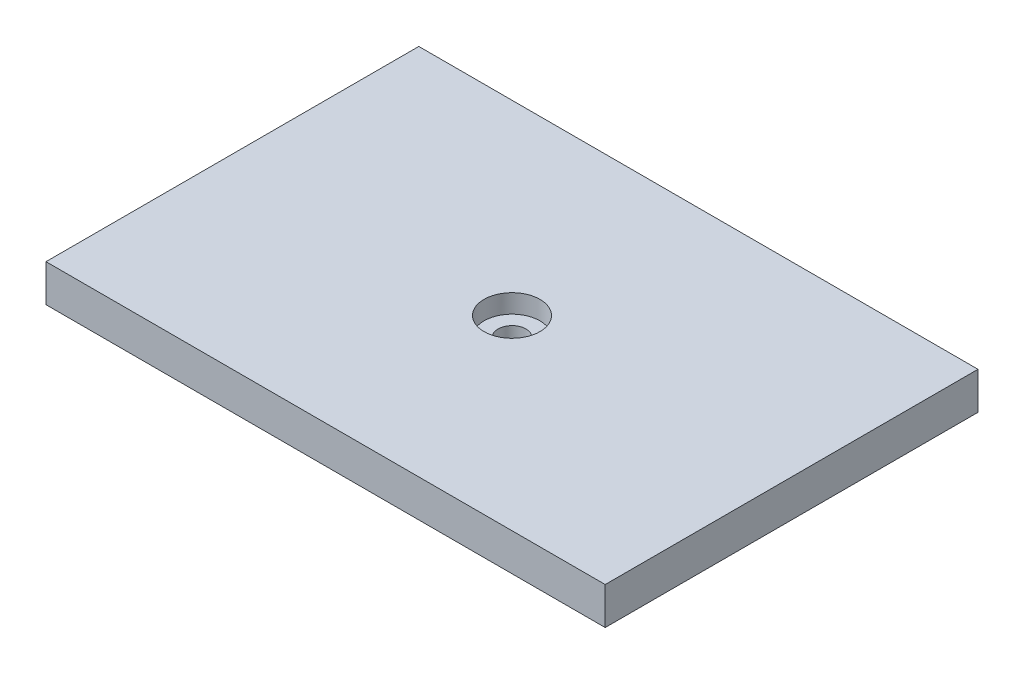
ISO-10303-21;
HEADER;
FILE_DESCRIPTION(('STEP AP214'),'2;1');
FILE_NAME('part.step','',(''),(''),'','','');
FILE_SCHEMA(('AUTOMOTIVE_DESIGN { 1 0 10303 214 1 1 1 1 }'));
ENDSEC;
DATA;
#1=APPLICATION_CONTEXT('core data for automotive mechanical design processes');
#2=APPLICATION_PROTOCOL_DEFINITION('international standard','automotive_design',2000,#1);
#3=PRODUCT_CONTEXT('',#1,'mechanical');
#4=PRODUCT('Part','Part','',(#3));
#5=PRODUCT_RELATED_PRODUCT_CATEGORY('part','',(#4));
#6=PRODUCT_DEFINITION_FORMATION('','',#4);
#7=PRODUCT_DEFINITION_CONTEXT('part definition',#1,'design');
#8=PRODUCT_DEFINITION('design','',#6,#7);
#9=PRODUCT_DEFINITION_SHAPE('','',#8);
#10=(LENGTH_UNIT() NAMED_UNIT(*) SI_UNIT(.MILLI.,.METRE.));
#11=(NAMED_UNIT(*) PLANE_ANGLE_UNIT() SI_UNIT($,.RADIAN.));
#12=(NAMED_UNIT(*) SI_UNIT($,.STERADIAN.) SOLID_ANGLE_UNIT());
#13=UNCERTAINTY_MEASURE_WITH_UNIT(LENGTH_MEASURE(1.E-05),#10,'distance_accuracy_value','');
#14=(GEOMETRIC_REPRESENTATION_CONTEXT(3) GLOBAL_UNCERTAINTY_ASSIGNED_CONTEXT((#13)) GLOBAL_UNIT_ASSIGNED_CONTEXT((#10,
#11,#12)) REPRESENTATION_CONTEXT('',''));
#15=CARTESIAN_POINT('',(0.,0.,0.));
#16=DIRECTION('',(0.,0.,1.));
#17=DIRECTION('',(1.,0.,0.));
#18=AXIS2_PLACEMENT_3D('',#15,#16,#17);
#19=CARTESIAN_POINT('',(0.,-8.48528137423857,0.));
#20=DIRECTION('',(0.,1.,0.));
#21=DIRECTION('',(0.,0.,1.));
#22=AXIS2_PLACEMENT_3D('',#19,#20,#21);
#23=CYLINDRICAL_SURFACE('',#22,3.);
#24=CARTESIAN_POINT('',(0.,4.,0.));
#25=DIRECTION('',(0.,1.,0.));
#26=DIRECTION('',(0.,0.,1.));
#27=AXIS2_PLACEMENT_3D('',#24,#25,#26);
#28=CIRCLE('',#27,3.);
#29=CARTESIAN_POINT('',(0.,4.,3.));
#30=VERTEX_POINT('',#29);
#31=EDGE_CURVE('E119',#30,#30,#28,.T.);
#32=ORIENTED_EDGE('',*,*,#31,.T.);
#33=EDGE_LOOP('',(#32));
#34=FACE_BOUND('',#33,.T.);
#35=CARTESIAN_POINT('',(0.,2.,0.));
#36=DIRECTION('',(0.,-1.,0.));
#37=DIRECTION('',(0.,0.,-1.));
#38=AXIS2_PLACEMENT_3D('',#35,#36,#37);
#39=CIRCLE('',#38,3.);
#40=CARTESIAN_POINT('',(0.,2.,-3.));
#41=VERTEX_POINT('',#40);
#42=EDGE_CURVE('E11',#41,#41,#39,.F.);
#43=ORIENTED_EDGE('',*,*,#42,.F.);
#44=EDGE_LOOP('',(#43));
#45=FACE_BOUND('',#44,.T.);
#46=ADVANCED_FACE('F43',(#34,#45),#23,.F.);
#47=CARTESIAN_POINT('',(30.,4.,-20.));
#48=DIRECTION('',(-1.,0.,0.));
#49=DIRECTION('',(0.,0.,1.));
#50=AXIS2_PLACEMENT_3D('',#47,#48,#49);
#51=PLANE('',#50);
#52=DIRECTION('',(0.,0.,-1.));
#53=VECTOR('',#52,1.);
#54=CARTESIAN_POINT('',(30.,0.,-20.));
#55=LINE('',#54,#53);
#56=CARTESIAN_POINT('',(30.,0.,20.));
#57=VERTEX_POINT('',#56);
#58=CARTESIAN_POINT('',(30.,0.,-20.));
#59=VERTEX_POINT('',#58);
#60=EDGE_CURVE('E115',#57,#59,#55,.T.);
#61=ORIENTED_EDGE('',*,*,#60,.T.);
#62=DIRECTION('',(0.,-1.,0.));
#63=VECTOR('',#62,1.);
#64=CARTESIAN_POINT('',(30.,4.,-20.));
#65=LINE('',#64,#63);
#66=CARTESIAN_POINT('',(30.,4.,-20.));
#67=VERTEX_POINT('',#66);
#68=EDGE_CURVE('E53',#67,#59,#65,.T.);
#69=ORIENTED_EDGE('',*,*,#68,.F.);
#70=DIRECTION('',(0.,0.,-1.));
#71=VECTOR('',#70,1.);
#72=CARTESIAN_POINT('',(30.,4.,-20.));
#73=LINE('',#72,#71);
#74=CARTESIAN_POINT('',(30.,4.,20.));
#75=VERTEX_POINT('',#74);
#76=EDGE_CURVE('E97',#75,#67,#73,.T.);
#77=ORIENTED_EDGE('',*,*,#76,.F.);
#78=DIRECTION('',(0.,-1.,0.));
#79=VECTOR('',#78,1.);
#80=CARTESIAN_POINT('',(30.,4.,20.));
#81=LINE('',#80,#79);
#82=EDGE_CURVE('E111',#75,#57,#81,.T.);
#83=ORIENTED_EDGE('',*,*,#82,.T.);
#84=EDGE_LOOP('',(#61,#69,#77,#83));
#85=FACE_BOUND('',#84,.T.);
#86=ADVANCED_FACE('F45',(#85),#51,.F.);
#87=CARTESIAN_POINT('',(-30.,4.,-20.));
#88=DIRECTION('',(0.,0.,1.));
#89=DIRECTION('',(1.,0.,0.));
#90=AXIS2_PLACEMENT_3D('',#87,#88,#89);
#91=PLANE('',#90);
#92=DIRECTION('',(-1.,0.,0.));
#93=VECTOR('',#92,1.);
#94=CARTESIAN_POINT('',(-30.,0.,-20.));
#95=LINE('',#94,#93);
#96=CARTESIAN_POINT('',(-30.,0.,-20.));
#97=VERTEX_POINT('',#96);
#98=EDGE_CURVE('E103',#59,#97,#95,.T.);
#99=ORIENTED_EDGE('',*,*,#98,.T.);
#100=DIRECTION('',(0.,-1.,0.));
#101=VECTOR('',#100,1.);
#102=CARTESIAN_POINT('',(-30.,4.,-20.));
#103=LINE('',#102,#101);
#104=CARTESIAN_POINT('',(-30.,4.,-20.));
#105=VERTEX_POINT('',#104);
#106=EDGE_CURVE('E101',#105,#97,#103,.T.);
#107=ORIENTED_EDGE('',*,*,#106,.F.);
#108=DIRECTION('',(-1.,0.,0.));
#109=VECTOR('',#108,1.);
#110=CARTESIAN_POINT('',(-30.,4.,-20.));
#111=LINE('',#110,#109);
#112=EDGE_CURVE('E92',#67,#105,#111,.T.);
#113=ORIENTED_EDGE('',*,*,#112,.F.);
#114=ORIENTED_EDGE('',*,*,#68,.T.);
#115=EDGE_LOOP('',(#99,#107,#113,#114));
#116=FACE_BOUND('',#115,.T.);
#117=ADVANCED_FACE('F102',(#116),#91,.F.);
#118=CARTESIAN_POINT('',(-30.,4.,-20.));
#119=DIRECTION('',(1.,0.,0.));
#120=DIRECTION('',(0.,0.,-1.));
#121=AXIS2_PLACEMENT_3D('',#118,#119,#120);
#122=PLANE('',#121);
#123=DIRECTION('',(0.,0.,1.));
#124=VECTOR('',#123,1.);
#125=CARTESIAN_POINT('',(-30.,0.,-20.));
#126=LINE('',#125,#124);
#127=CARTESIAN_POINT('',(-30.,0.,20.));
#128=VERTEX_POINT('',#127);
#129=EDGE_CURVE('E78',#97,#128,#126,.T.);
#130=ORIENTED_EDGE('',*,*,#129,.T.);
#131=DIRECTION('',(0.,-1.,0.));
#132=VECTOR('',#131,1.);
#133=CARTESIAN_POINT('',(-30.,4.,20.));
#134=LINE('',#133,#132);
#135=CARTESIAN_POINT('',(-30.,4.,20.));
#136=VERTEX_POINT('',#135);
#137=EDGE_CURVE('E105',#136,#128,#134,.T.);
#138=ORIENTED_EDGE('',*,*,#137,.F.);
#139=DIRECTION('',(0.,0.,1.));
#140=VECTOR('',#139,1.);
#141=CARTESIAN_POINT('',(-30.,4.,-20.));
#142=LINE('',#141,#140);
#143=EDGE_CURVE('E95',#105,#136,#142,.T.);
#144=ORIENTED_EDGE('',*,*,#143,.F.);
#145=ORIENTED_EDGE('',*,*,#106,.T.);
#146=EDGE_LOOP('',(#130,#138,#144,#145));
#147=FACE_BOUND('',#146,.T.);
#148=ADVANCED_FACE('F107',(#147),#122,.F.);
#149=CARTESIAN_POINT('',(-30.,4.,20.));
#150=DIRECTION('',(0.,0.,-1.));
#151=DIRECTION('',(-1.,0.,0.));
#152=AXIS2_PLACEMENT_3D('',#149,#150,#151);
#153=PLANE('',#152);
#154=DIRECTION('',(1.,0.,0.));
#155=VECTOR('',#154,1.);
#156=CARTESIAN_POINT('',(-30.,0.,20.));
#157=LINE('',#156,#155);
#158=EDGE_CURVE('E84',#128,#57,#157,.T.);
#159=ORIENTED_EDGE('',*,*,#158,.T.);
#160=ORIENTED_EDGE('',*,*,#82,.F.);
#161=DIRECTION('',(1.,0.,0.));
#162=VECTOR('',#161,1.);
#163=CARTESIAN_POINT('',(-30.,4.,20.));
#164=LINE('',#163,#162);
#165=EDGE_CURVE('E61',#136,#75,#164,.T.);
#166=ORIENTED_EDGE('',*,*,#165,.F.);
#167=ORIENTED_EDGE('',*,*,#137,.T.);
#168=EDGE_LOOP('',(#159,#160,#166,#167));
#169=FACE_BOUND('',#168,.T.);
#170=ADVANCED_FACE('F157',(#169),#153,.F.);
#171=CARTESIAN_POINT('',(0.,4.,0.));
#172=DIRECTION('',(0.,1.,0.));
#173=DIRECTION('',(0.,0.,1.));
#174=AXIS2_PLACEMENT_3D('',#171,#172,#173);
#175=PLANE('',#174);
#176=ORIENTED_EDGE('',*,*,#31,.F.);
#177=EDGE_LOOP('',(#176));
#178=FACE_BOUND('',#177,.T.);
#179=ORIENTED_EDGE('',*,*,#76,.T.);
#180=ORIENTED_EDGE('',*,*,#112,.T.);
#181=ORIENTED_EDGE('',*,*,#143,.T.);
#182=ORIENTED_EDGE('',*,*,#165,.T.);
#183=EDGE_LOOP('',(#179,#180,#181,#182));
#184=FACE_BOUND('',#183,.T.);
#185=ADVANCED_FACE('F93',(#178,#184),#175,.T.);
#186=CARTESIAN_POINT('',(0.,0.,0.));
#187=DIRECTION('',(0.,1.,0.));
#188=DIRECTION('',(0.,0.,1.));
#189=AXIS2_PLACEMENT_3D('',#186,#187,#188);
#190=PLANE('',#189);
#191=ORIENTED_EDGE('',*,*,#60,.F.);
#192=ORIENTED_EDGE('',*,*,#158,.F.);
#193=ORIENTED_EDGE('',*,*,#129,.F.);
#194=ORIENTED_EDGE('',*,*,#98,.F.);
#195=EDGE_LOOP('',(#191,#192,#193,#194));
#196=FACE_BOUND('',#195,.T.);
#197=CARTESIAN_POINT('',(0.,0.,0.));
#198=DIRECTION('',(0.,-1.,0.));
#199=DIRECTION('',(0.,0.,-1.));
#200=AXIS2_PLACEMENT_3D('',#197,#198,#199);
#201=CIRCLE('',#200,1.5);
#202=CARTESIAN_POINT('',(0.,0.,-1.5));
#203=VERTEX_POINT('',#202);
#204=EDGE_CURVE('E140',#203,#203,#201,.T.);
#205=ORIENTED_EDGE('',*,*,#204,.F.);
#206=EDGE_LOOP('',(#205));
#207=FACE_BOUND('',#206,.T.);
#208=ADVANCED_FACE('F133',(#196,#207),#190,.F.);
#209=CARTESIAN_POINT('',(0.,2.,0.));
#210=DIRECTION('',(0.,-1.,0.));
#211=DIRECTION('',(0.,0.,-1.));
#212=AXIS2_PLACEMENT_3D('',#209,#210,#211);
#213=PLANE('',#212);
#214=CARTESIAN_POINT('',(0.,2.,0.));
#215=DIRECTION('',(0.,-1.,0.));
#216=DIRECTION('',(0.,0.,-1.));
#217=AXIS2_PLACEMENT_3D('',#214,#215,#216);
#218=CIRCLE('',#217,1.5);
#219=CARTESIAN_POINT('',(0.,2.,-1.5));
#220=VERTEX_POINT('',#219);
#221=EDGE_CURVE('E143',#220,#220,#218,.T.);
#222=ORIENTED_EDGE('',*,*,#221,.T.);
#223=EDGE_LOOP('',(#222));
#224=FACE_BOUND('',#223,.T.);
#225=ORIENTED_EDGE('',*,*,#42,.T.);
#226=EDGE_LOOP('',(#225));
#227=FACE_BOUND('',#226,.T.);
#228=ADVANCED_FACE('F136',(#224,#227),#213,.F.);
#229=CARTESIAN_POINT('',(0.,2.,0.));
#230=DIRECTION('',(0.,-1.,0.));
#231=DIRECTION('',(0.,0.,-1.));
#232=AXIS2_PLACEMENT_3D('',#229,#230,#231);
#233=CYLINDRICAL_SURFACE('',#232,1.5);
#234=ORIENTED_EDGE('',*,*,#221,.F.);
#235=EDGE_LOOP('',(#234));
#236=FACE_BOUND('',#235,.T.);
#237=ORIENTED_EDGE('',*,*,#204,.T.);
#238=EDGE_LOOP('',(#237));
#239=FACE_BOUND('',#238,.T.);
#240=ADVANCED_FACE('F171',(#236,#239),#233,.F.);
#241=CLOSED_SHELL('',(#46,#86,#117,#148,#170,#185,#208,#228,#240));
#242=MANIFOLD_SOLID_BREP('B2',#241);
#243=ADVANCED_BREP_SHAPE_REPRESENTATION('',(#18,#242),#14);
#244=SHAPE_DEFINITION_REPRESENTATION(#9,#243);
ENDSEC;
END-ISO-10303-21;
